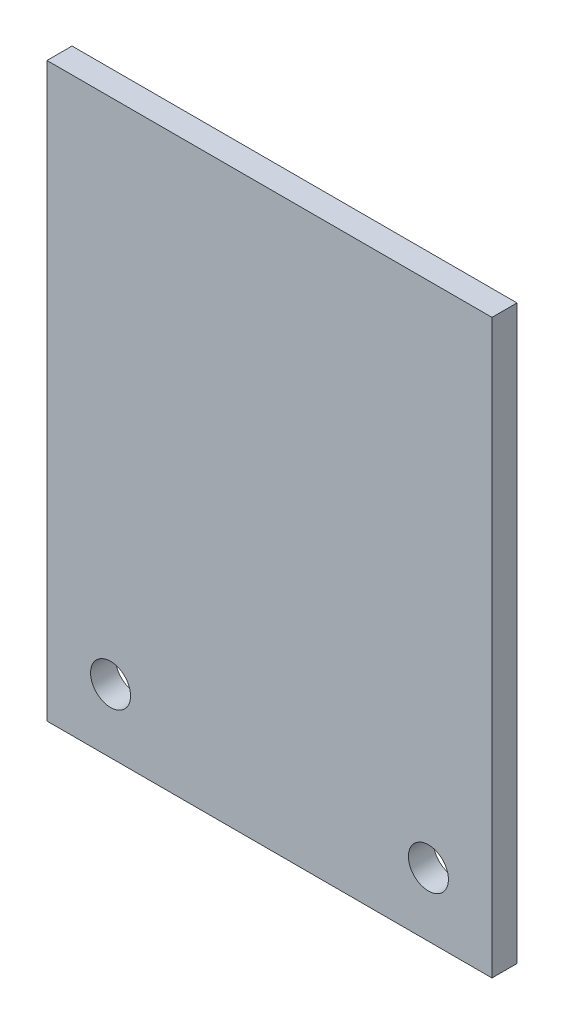
ISO-10303-21;
HEADER;
FILE_DESCRIPTION(('STEP AP214'),'2;1');
FILE_NAME('part.step','',(''),(''),'','','');
FILE_SCHEMA(('AUTOMOTIVE_DESIGN { 1 0 10303 214 1 1 1 1 }'));
ENDSEC;
DATA;
#1=APPLICATION_CONTEXT('core data for automotive mechanical design processes');
#2=APPLICATION_PROTOCOL_DEFINITION('international standard','automotive_design',2000,#1);
#3=PRODUCT_CONTEXT('',#1,'mechanical');
#4=PRODUCT('Part','Part','',(#3));
#5=PRODUCT_RELATED_PRODUCT_CATEGORY('part','',(#4));
#6=PRODUCT_DEFINITION_FORMATION('','',#4);
#7=PRODUCT_DEFINITION_CONTEXT('part definition',#1,'design');
#8=PRODUCT_DEFINITION('design','',#6,#7);
#9=PRODUCT_DEFINITION_SHAPE('','',#8);
#10=(LENGTH_UNIT() NAMED_UNIT(*) SI_UNIT(.MILLI.,.METRE.));
#11=(NAMED_UNIT(*) PLANE_ANGLE_UNIT() SI_UNIT($,.RADIAN.));
#12=(NAMED_UNIT(*) SI_UNIT($,.STERADIAN.) SOLID_ANGLE_UNIT());
#13=UNCERTAINTY_MEASURE_WITH_UNIT(LENGTH_MEASURE(1.E-05),#10,'distance_accuracy_value','');
#14=(GEOMETRIC_REPRESENTATION_CONTEXT(3) GLOBAL_UNCERTAINTY_ASSIGNED_CONTEXT((#13)) GLOBAL_UNIT_ASSIGNED_CONTEXT((#10,
#11,#12)) REPRESENTATION_CONTEXT('',''));
#15=CARTESIAN_POINT('',(0.,0.,0.));
#16=DIRECTION('',(0.,0.,1.));
#17=DIRECTION('',(1.,0.,0.));
#18=AXIS2_PLACEMENT_3D('',#15,#16,#17);
#19=CARTESIAN_POINT('',(0.,0.,1.5));
#20=DIRECTION('',(0.,0.,1.));
#21=DIRECTION('',(1.,0.,0.));
#22=AXIS2_PLACEMENT_3D('',#19,#20,#21);
#23=PLANE('',#22);
#24=CARTESIAN_POINT('',(-9.525,-13.335,1.5));
#25=DIRECTION('',(0.,0.,1.));
#26=DIRECTION('',(1.,0.,0.));
#27=AXIS2_PLACEMENT_3D('',#24,#25,#26);
#28=CIRCLE('',#27,1.2);
#29=CARTESIAN_POINT('',(-8.325,-13.335,1.5));
#30=VERTEX_POINT('',#29);
#31=EDGE_CURVE('E109',#30,#30,#28,.T.);
#32=ORIENTED_EDGE('',*,*,#31,.F.);
#33=EDGE_LOOP('',(#32));
#34=FACE_BOUND('',#33,.T.);
#35=DIRECTION('',(-1.,0.,0.));
#36=VECTOR('',#35,1.);
#37=CARTESIAN_POINT('',(-13.335,17.145,1.5));
#38=LINE('',#37,#36);
#39=CARTESIAN_POINT('',(13.335,17.145,1.5));
#40=VERTEX_POINT('',#39);
#41=CARTESIAN_POINT('',(-13.335,17.145,1.5));
#42=VERTEX_POINT('',#41);
#43=EDGE_CURVE('E93',#40,#42,#38,.T.);
#44=ORIENTED_EDGE('',*,*,#43,.T.);
#45=DIRECTION('',(0.,-1.,0.));
#46=VECTOR('',#45,1.);
#47=CARTESIAN_POINT('',(-13.335,-17.145,1.5));
#48=LINE('',#47,#46);
#49=CARTESIAN_POINT('',(-13.335,-17.145,1.5));
#50=VERTEX_POINT('',#49);
#51=EDGE_CURVE('E88',#42,#50,#48,.T.);
#52=ORIENTED_EDGE('',*,*,#51,.T.);
#53=DIRECTION('',(1.,0.,0.));
#54=VECTOR('',#53,1.);
#55=CARTESIAN_POINT('',(-13.335,-17.145,1.5));
#56=LINE('',#55,#54);
#57=CARTESIAN_POINT('',(13.335,-17.145,1.5));
#58=VERTEX_POINT('',#57);
#59=EDGE_CURVE('E91',#50,#58,#56,.T.);
#60=ORIENTED_EDGE('',*,*,#59,.T.);
#61=DIRECTION('',(0.,1.,0.));
#62=VECTOR('',#61,1.);
#63=CARTESIAN_POINT('',(13.335,-17.145,1.5));
#64=LINE('',#63,#62);
#65=EDGE_CURVE('E59',#58,#40,#64,.T.);
#66=ORIENTED_EDGE('',*,*,#65,.T.);
#67=EDGE_LOOP('',(#44,#52,#60,#66));
#68=FACE_BOUND('',#67,.T.);
#69=CARTESIAN_POINT('',(9.525,-13.335,1.5));
#70=DIRECTION('',(0.,0.,1.));
#71=DIRECTION('',(-1.,0.,0.));
#72=AXIS2_PLACEMENT_3D('',#69,#70,#71);
#73=CIRCLE('',#72,1.2);
#74=CARTESIAN_POINT('',(8.325,-13.335,1.5));
#75=VERTEX_POINT('',#74);
#76=EDGE_CURVE('E121',#75,#75,#73,.T.);
#77=ORIENTED_EDGE('',*,*,#76,.F.);
#78=EDGE_LOOP('',(#77));
#79=FACE_BOUND('',#78,.T.);
#80=ADVANCED_FACE('F41',(#34,#68,#79),#23,.T.);
#81=CARTESIAN_POINT('',(0.,0.,0.));
#82=DIRECTION('',(0.,0.,1.));
#83=DIRECTION('',(1.,0.,0.));
#84=AXIS2_PLACEMENT_3D('',#81,#82,#83);
#85=PLANE('',#84);
#86=DIRECTION('',(-1.,0.,0.));
#87=VECTOR('',#86,1.);
#88=CARTESIAN_POINT('',(-13.335,17.145,0.));
#89=LINE('',#88,#87);
#90=CARTESIAN_POINT('',(13.335,17.145,0.));
#91=VERTEX_POINT('',#90);
#92=CARTESIAN_POINT('',(-13.335,17.145,0.));
#93=VERTEX_POINT('',#92);
#94=EDGE_CURVE('E103',#91,#93,#89,.T.);
#95=ORIENTED_EDGE('',*,*,#94,.F.);
#96=DIRECTION('',(0.,1.,0.));
#97=VECTOR('',#96,1.);
#98=CARTESIAN_POINT('',(13.335,-17.145,0.));
#99=LINE('',#98,#97);
#100=CARTESIAN_POINT('',(13.335,-17.145,0.));
#101=VERTEX_POINT('',#100);
#102=EDGE_CURVE('E83',#101,#91,#99,.T.);
#103=ORIENTED_EDGE('',*,*,#102,.F.);
#104=DIRECTION('',(1.,0.,0.));
#105=VECTOR('',#104,1.);
#106=CARTESIAN_POINT('',(-13.335,-17.145,0.));
#107=LINE('',#106,#105);
#108=CARTESIAN_POINT('',(-13.335,-17.145,0.));
#109=VERTEX_POINT('',#108);
#110=EDGE_CURVE('E75',#109,#101,#107,.T.);
#111=ORIENTED_EDGE('',*,*,#110,.F.);
#112=DIRECTION('',(0.,-1.,0.));
#113=VECTOR('',#112,1.);
#114=CARTESIAN_POINT('',(-13.335,-17.145,0.));
#115=LINE('',#114,#113);
#116=EDGE_CURVE('E100',#93,#109,#115,.T.);
#117=ORIENTED_EDGE('',*,*,#116,.F.);
#118=EDGE_LOOP('',(#95,#103,#111,#117));
#119=FACE_BOUND('',#118,.T.);
#120=CARTESIAN_POINT('',(-9.525,-13.335,0.));
#121=DIRECTION('',(0.,0.,1.));
#122=DIRECTION('',(1.,0.,0.));
#123=AXIS2_PLACEMENT_3D('',#120,#121,#122);
#124=CIRCLE('',#123,1.2);
#125=CARTESIAN_POINT('',(-8.325,-13.335,0.));
#126=VERTEX_POINT('',#125);
#127=EDGE_CURVE('E120',#126,#126,#124,.T.);
#128=ORIENTED_EDGE('',*,*,#127,.T.);
#129=EDGE_LOOP('',(#128));
#130=FACE_BOUND('',#129,.T.);
#131=CARTESIAN_POINT('',(9.525,-13.335,0.));
#132=DIRECTION('',(0.,0.,1.));
#133=DIRECTION('',(-1.,0.,0.));
#134=AXIS2_PLACEMENT_3D('',#131,#132,#133);
#135=CIRCLE('',#134,1.2);
#136=CARTESIAN_POINT('',(8.325,-13.335,0.));
#137=VERTEX_POINT('',#136);
#138=EDGE_CURVE('E128',#137,#137,#135,.T.);
#139=ORIENTED_EDGE('',*,*,#138,.T.);
#140=EDGE_LOOP('',(#139));
#141=FACE_BOUND('',#140,.T.);
#142=ADVANCED_FACE('F116',(#119,#130,#141),#85,.F.);
#143=CARTESIAN_POINT('',(-13.335,17.145,1.5));
#144=DIRECTION('',(0.,-1.,0.));
#145=DIRECTION('',(1.,0.,0.));
#146=AXIS2_PLACEMENT_3D('',#143,#144,#145);
#147=PLANE('',#146);
#148=ORIENTED_EDGE('',*,*,#94,.T.);
#149=DIRECTION('',(0.,0.,-1.));
#150=VECTOR('',#149,1.);
#151=CARTESIAN_POINT('',(-13.335,17.145,1.5));
#152=LINE('',#151,#150);
#153=EDGE_CURVE('E11',#42,#93,#152,.T.);
#154=ORIENTED_EDGE('',*,*,#153,.F.);
#155=ORIENTED_EDGE('',*,*,#43,.F.);
#156=DIRECTION('',(0.,0.,-1.));
#157=VECTOR('',#156,1.);
#158=CARTESIAN_POINT('',(13.335,17.145,1.5));
#159=LINE('',#158,#157);
#160=EDGE_CURVE('E102',#40,#91,#159,.T.);
#161=ORIENTED_EDGE('',*,*,#160,.T.);
#162=EDGE_LOOP('',(#148,#154,#155,#161));
#163=FACE_BOUND('',#162,.T.);
#164=ADVANCED_FACE('F43',(#163),#147,.F.);
#165=CARTESIAN_POINT('',(-13.335,-17.145,1.5));
#166=DIRECTION('',(1.,0.,0.));
#167=DIRECTION('',(0.,1.,0.));
#168=AXIS2_PLACEMENT_3D('',#165,#166,#167);
#169=PLANE('',#168);
#170=ORIENTED_EDGE('',*,*,#116,.T.);
#171=DIRECTION('',(0.,0.,-1.));
#172=VECTOR('',#171,1.);
#173=CARTESIAN_POINT('',(-13.335,-17.145,1.5));
#174=LINE('',#173,#172);
#175=EDGE_CURVE('E49',#50,#109,#174,.T.);
#176=ORIENTED_EDGE('',*,*,#175,.F.);
#177=ORIENTED_EDGE('',*,*,#51,.F.);
#178=ORIENTED_EDGE('',*,*,#153,.T.);
#179=EDGE_LOOP('',(#170,#176,#177,#178));
#180=FACE_BOUND('',#179,.T.);
#181=ADVANCED_FACE('F96',(#180),#169,.F.);
#182=CARTESIAN_POINT('',(-13.335,-17.145,1.5));
#183=DIRECTION('',(0.,1.,0.));
#184=DIRECTION('',(0.,0.,1.));
#185=AXIS2_PLACEMENT_3D('',#182,#183,#184);
#186=PLANE('',#185);
#187=ORIENTED_EDGE('',*,*,#110,.T.);
#188=DIRECTION('',(0.,0.,-1.));
#189=VECTOR('',#188,1.);
#190=CARTESIAN_POINT('',(13.335,-17.145,1.5));
#191=LINE('',#190,#189);
#192=EDGE_CURVE('E97',#58,#101,#191,.T.);
#193=ORIENTED_EDGE('',*,*,#192,.F.);
#194=ORIENTED_EDGE('',*,*,#59,.F.);
#195=ORIENTED_EDGE('',*,*,#175,.T.);
#196=EDGE_LOOP('',(#187,#193,#194,#195));
#197=FACE_BOUND('',#196,.T.);
#198=ADVANCED_FACE('F98',(#197),#186,.F.);
#199=CARTESIAN_POINT('',(13.335,-17.145,1.5));
#200=DIRECTION('',(-1.,0.,0.));
#201=DIRECTION('',(0.,-1.,0.));
#202=AXIS2_PLACEMENT_3D('',#199,#200,#201);
#203=PLANE('',#202);
#204=ORIENTED_EDGE('',*,*,#102,.T.);
#205=ORIENTED_EDGE('',*,*,#160,.F.);
#206=ORIENTED_EDGE('',*,*,#65,.F.);
#207=ORIENTED_EDGE('',*,*,#192,.T.);
#208=EDGE_LOOP('',(#204,#205,#206,#207));
#209=FACE_BOUND('',#208,.T.);
#210=ADVANCED_FACE('F111',(#209),#203,.F.);
#211=CARTESIAN_POINT('',(-9.525,-13.335,1.5));
#212=DIRECTION('',(0.,0.,-1.));
#213=DIRECTION('',(-1.,0.,0.));
#214=AXIS2_PLACEMENT_3D('',#211,#212,#213);
#215=CYLINDRICAL_SURFACE('',#214,1.2);
#216=ORIENTED_EDGE('',*,*,#31,.T.);
#217=EDGE_LOOP('',(#216));
#218=FACE_BOUND('',#217,.T.);
#219=ORIENTED_EDGE('',*,*,#127,.F.);
#220=EDGE_LOOP('',(#219));
#221=FACE_BOUND('',#220,.T.);
#222=ADVANCED_FACE('F145',(#218,#221),#215,.F.);
#223=CARTESIAN_POINT('',(9.525,-13.335,1.5));
#224=DIRECTION('',(0.,0.,-1.));
#225=DIRECTION('',(-1.,0.,0.));
#226=AXIS2_PLACEMENT_3D('',#223,#224,#225);
#227=CYLINDRICAL_SURFACE('',#226,1.2);
#228=ORIENTED_EDGE('',*,*,#76,.T.);
#229=EDGE_LOOP('',(#228));
#230=FACE_BOUND('',#229,.T.);
#231=ORIENTED_EDGE('',*,*,#138,.F.);
#232=EDGE_LOOP('',(#231));
#233=FACE_BOUND('',#232,.T.);
#234=ADVANCED_FACE('F135',(#230,#233),#227,.F.);
#235=CLOSED_SHELL('',(#80,#142,#164,#181,#198,#210,#222,#234));
#236=MANIFOLD_SOLID_BREP('B2',#235);
#237=ADVANCED_BREP_SHAPE_REPRESENTATION('',(#18,#236),#14);
#238=SHAPE_DEFINITION_REPRESENTATION(#9,#237);
ENDSEC;
END-ISO-10303-21;
